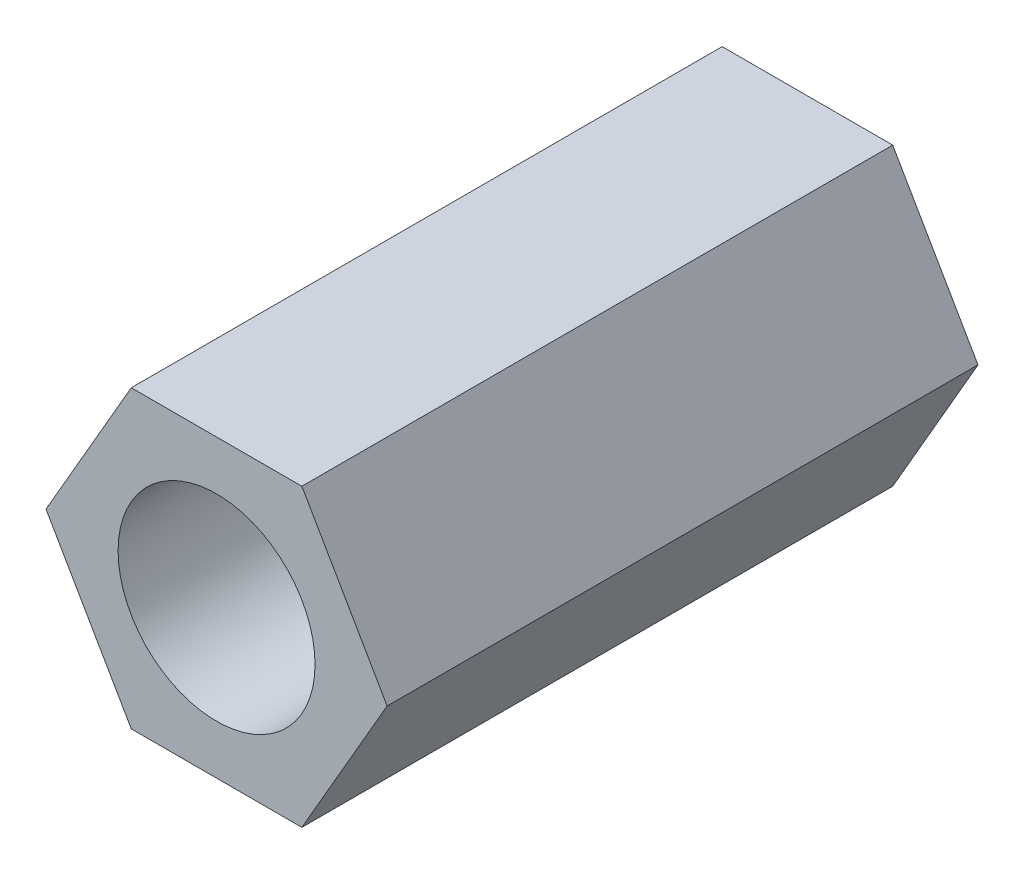
ISO-10303-21;
HEADER;
FILE_DESCRIPTION(('STEP AP214'),'2;1');
FILE_NAME('part.step','',(''),(''),'','','');
FILE_SCHEMA(('AUTOMOTIVE_DESIGN { 1 0 10303 214 1 1 1 1 }'));
ENDSEC;
DATA;
#1=APPLICATION_CONTEXT('core data for automotive mechanical design processes');
#2=APPLICATION_PROTOCOL_DEFINITION('international standard','automotive_design',2000,#1);
#3=PRODUCT_CONTEXT('',#1,'mechanical');
#4=PRODUCT('Part','Part','',(#3));
#5=PRODUCT_RELATED_PRODUCT_CATEGORY('part','',(#4));
#6=PRODUCT_DEFINITION_FORMATION('','',#4);
#7=PRODUCT_DEFINITION_CONTEXT('part definition',#1,'design');
#8=PRODUCT_DEFINITION('design','',#6,#7);
#9=PRODUCT_DEFINITION_SHAPE('','',#8);
#10=(LENGTH_UNIT() NAMED_UNIT(*) SI_UNIT(.MILLI.,.METRE.));
#11=(NAMED_UNIT(*) PLANE_ANGLE_UNIT() SI_UNIT($,.RADIAN.));
#12=(NAMED_UNIT(*) SI_UNIT($,.STERADIAN.) SOLID_ANGLE_UNIT());
#13=UNCERTAINTY_MEASURE_WITH_UNIT(LENGTH_MEASURE(1.E-05),#10,'distance_accuracy_value','');
#14=(GEOMETRIC_REPRESENTATION_CONTEXT(3) GLOBAL_UNCERTAINTY_ASSIGNED_CONTEXT((#13)) GLOBAL_UNIT_ASSIGNED_CONTEXT((#10,
#11,#12)) REPRESENTATION_CONTEXT('',''));
#15=CARTESIAN_POINT('',(0.,0.,0.));
#16=DIRECTION('',(0.,0.,1.));
#17=DIRECTION('',(1.,0.,0.));
#18=AXIS2_PLACEMENT_3D('',#15,#16,#17);
#19=CARTESIAN_POINT('',(-5.49926131403119,9.52500000000001,38.1));
#20=DIRECTION('',(0.866025403784439,-0.5,0.));
#21=DIRECTION('',(0.5,0.866025403784439,0.));
#22=AXIS2_PLACEMENT_3D('',#19,#20,#21);
#23=PLANE('',#22);
#24=DIRECTION('',(-0.5,-0.866025403784439,0.));
#25=VECTOR('',#24,1.);
#26=CARTESIAN_POINT('',(-5.49926131403119,9.52500000000001,0.));
#27=LINE('',#26,#25);
#28=CARTESIAN_POINT('',(-5.49926131403119,9.52500000000001,0.));
#29=VERTEX_POINT('',#28);
#30=CARTESIAN_POINT('',(-10.9985226280624,0.,0.));
#31=VERTEX_POINT('',#30);
#32=EDGE_CURVE('E116',#29,#31,#27,.T.);
#33=ORIENTED_EDGE('',*,*,#32,.T.);
#34=DIRECTION('',(0.,0.,-1.));
#35=VECTOR('',#34,1.);
#36=CARTESIAN_POINT('',(-10.9985226280624,0.,38.1));
#37=LINE('',#36,#35);
#38=CARTESIAN_POINT('',(-10.9985226280624,0.,38.1));
#39=VERTEX_POINT('',#38);
#40=EDGE_CURVE('E11',#39,#31,#37,.T.);
#41=ORIENTED_EDGE('',*,*,#40,.F.);
#42=DIRECTION('',(-0.5,-0.866025403784439,0.));
#43=VECTOR('',#42,1.);
#44=CARTESIAN_POINT('',(-5.49926131403119,9.52500000000001,38.1));
#45=LINE('',#44,#43);
#46=CARTESIAN_POINT('',(-5.49926131403119,9.52500000000001,38.1));
#47=VERTEX_POINT('',#46);
#48=EDGE_CURVE('E127',#47,#39,#45,.T.);
#49=ORIENTED_EDGE('',*,*,#48,.F.);
#50=DIRECTION('',(0.,0.,-1.));
#51=VECTOR('',#50,1.);
#52=CARTESIAN_POINT('',(-5.49926131403119,9.52500000000001,38.1));
#53=LINE('',#52,#51);
#54=EDGE_CURVE('E112',#47,#29,#53,.T.);
#55=ORIENTED_EDGE('',*,*,#54,.T.);
#56=EDGE_LOOP('',(#33,#41,#49,#55));
#57=FACE_BOUND('',#56,.T.);
#58=ADVANCED_FACE('F32',(#57),#23,.F.);
#59=CARTESIAN_POINT('',(-10.9985226280624,0.,38.1));
#60=DIRECTION('',(0.866025403784439,0.5,0.));
#61=DIRECTION('',(-0.5,0.866025403784439,0.));
#62=AXIS2_PLACEMENT_3D('',#59,#60,#61);
#63=PLANE('',#62);
#64=DIRECTION('',(0.5,-0.866025403784439,0.));
#65=VECTOR('',#64,1.);
#66=CARTESIAN_POINT('',(-10.9985226280624,0.,0.));
#67=LINE('',#66,#65);
#68=CARTESIAN_POINT('',(-5.4992613140312,-9.52499999999999,0.));
#69=VERTEX_POINT('',#68);
#70=EDGE_CURVE('E119',#31,#69,#67,.T.);
#71=ORIENTED_EDGE('',*,*,#70,.T.);
#72=DIRECTION('',(0.,0.,-1.));
#73=VECTOR('',#72,1.);
#74=CARTESIAN_POINT('',(-5.4992613140312,-9.52499999999999,38.1));
#75=LINE('',#74,#73);
#76=CARTESIAN_POINT('',(-5.4992613140312,-9.52499999999999,38.1));
#77=VERTEX_POINT('',#76);
#78=EDGE_CURVE('E40',#77,#69,#75,.T.);
#79=ORIENTED_EDGE('',*,*,#78,.F.);
#80=DIRECTION('',(0.5,-0.866025403784439,0.));
#81=VECTOR('',#80,1.);
#82=CARTESIAN_POINT('',(-10.9985226280624,0.,38.1));
#83=LINE('',#82,#81);
#84=EDGE_CURVE('E85',#39,#77,#83,.T.);
#85=ORIENTED_EDGE('',*,*,#84,.F.);
#86=ORIENTED_EDGE('',*,*,#40,.T.);
#87=EDGE_LOOP('',(#71,#79,#85,#86));
#88=FACE_BOUND('',#87,.T.);
#89=ADVANCED_FACE('F152',(#88),#63,.F.);
#90=CARTESIAN_POINT('',(-5.4992613140312,-9.52499999999999,38.1));
#91=DIRECTION('',(0.,1.,0.));
#92=DIRECTION('',(-1.,0.,0.));
#93=AXIS2_PLACEMENT_3D('',#90,#91,#92);
#94=PLANE('',#93);
#95=DIRECTION('',(1.,0.,0.));
#96=VECTOR('',#95,1.);
#97=CARTESIAN_POINT('',(-5.4992613140312,-9.52499999999999,0.));
#98=LINE('',#97,#96);
#99=CARTESIAN_POINT('',(5.49926131403118,-9.52499999999999,0.));
#100=VERTEX_POINT('',#99);
#101=EDGE_CURVE('E122',#69,#100,#98,.T.);
#102=ORIENTED_EDGE('',*,*,#101,.T.);
#103=DIRECTION('',(0.,0.,-1.));
#104=VECTOR('',#103,1.);
#105=CARTESIAN_POINT('',(5.49926131403118,-9.52499999999999,38.1));
#106=LINE('',#105,#104);
#107=CARTESIAN_POINT('',(5.49926131403118,-9.52499999999999,38.1));
#108=VERTEX_POINT('',#107);
#109=EDGE_CURVE('E107',#108,#100,#106,.T.);
#110=ORIENTED_EDGE('',*,*,#109,.F.);
#111=DIRECTION('',(1.,0.,0.));
#112=VECTOR('',#111,1.);
#113=CARTESIAN_POINT('',(-5.4992613140312,-9.52499999999999,38.1));
#114=LINE('',#113,#112);
#115=EDGE_CURVE('E98',#77,#108,#114,.T.);
#116=ORIENTED_EDGE('',*,*,#115,.F.);
#117=ORIENTED_EDGE('',*,*,#78,.T.);
#118=EDGE_LOOP('',(#102,#110,#116,#117));
#119=FACE_BOUND('',#118,.T.);
#120=ADVANCED_FACE('F133',(#119),#94,.F.);
#121=CARTESIAN_POINT('',(5.49926131403118,-9.52499999999999,38.1));
#122=DIRECTION('',(-0.866025403784439,0.5,0.));
#123=DIRECTION('',(-0.5,-0.866025403784439,0.));
#124=AXIS2_PLACEMENT_3D('',#121,#122,#123);
#125=PLANE('',#124);
#126=DIRECTION('',(0.5,0.866025403784439,0.));
#127=VECTOR('',#126,1.);
#128=CARTESIAN_POINT('',(5.49926131403118,-9.52499999999999,0.));
#129=LINE('',#128,#127);
#130=CARTESIAN_POINT('',(10.9985226280624,0.,0.));
#131=VERTEX_POINT('',#130);
#132=EDGE_CURVE('E106',#100,#131,#129,.T.);
#133=ORIENTED_EDGE('',*,*,#132,.T.);
#134=DIRECTION('',(0.,0.,-1.));
#135=VECTOR('',#134,1.);
#136=CARTESIAN_POINT('',(10.9985226280624,0.,38.1));
#137=LINE('',#136,#135);
#138=CARTESIAN_POINT('',(10.9985226280624,0.,38.1));
#139=VERTEX_POINT('',#138);
#140=EDGE_CURVE('E103',#139,#131,#137,.T.);
#141=ORIENTED_EDGE('',*,*,#140,.F.);
#142=DIRECTION('',(0.5,0.866025403784439,0.));
#143=VECTOR('',#142,1.);
#144=CARTESIAN_POINT('',(5.49926131403118,-9.52499999999999,38.1));
#145=LINE('',#144,#143);
#146=EDGE_CURVE('E92',#108,#139,#145,.T.);
#147=ORIENTED_EDGE('',*,*,#146,.F.);
#148=ORIENTED_EDGE('',*,*,#109,.T.);
#149=EDGE_LOOP('',(#133,#141,#147,#148));
#150=FACE_BOUND('',#149,.T.);
#151=ADVANCED_FACE('F104',(#150),#125,.F.);
#152=CARTESIAN_POINT('',(10.9985226280624,0.,38.1));
#153=DIRECTION('',(-0.866025403784439,-0.5,0.));
#154=DIRECTION('',(0.5,-0.866025403784439,0.));
#155=AXIS2_PLACEMENT_3D('',#152,#153,#154);
#156=PLANE('',#155);
#157=DIRECTION('',(-0.5,0.866025403784439,0.));
#158=VECTOR('',#157,1.);
#159=CARTESIAN_POINT('',(10.9985226280624,0.,0.));
#160=LINE('',#159,#158);
#161=CARTESIAN_POINT('',(5.49926131403119,9.52500000000001,0.));
#162=VERTEX_POINT('',#161);
#163=EDGE_CURVE('E71',#131,#162,#160,.T.);
#164=ORIENTED_EDGE('',*,*,#163,.T.);
#165=DIRECTION('',(0.,0.,-1.));
#166=VECTOR('',#165,1.);
#167=CARTESIAN_POINT('',(5.49926131403119,9.52500000000001,38.1));
#168=LINE('',#167,#166);
#169=CARTESIAN_POINT('',(5.49926131403119,9.52500000000001,38.1));
#170=VERTEX_POINT('',#169);
#171=EDGE_CURVE('E108',#170,#162,#168,.T.);
#172=ORIENTED_EDGE('',*,*,#171,.F.);
#173=DIRECTION('',(-0.5,0.866025403784439,0.));
#174=VECTOR('',#173,1.);
#175=CARTESIAN_POINT('',(10.9985226280624,0.,38.1));
#176=LINE('',#175,#174);
#177=EDGE_CURVE('E96',#139,#170,#176,.T.);
#178=ORIENTED_EDGE('',*,*,#177,.F.);
#179=ORIENTED_EDGE('',*,*,#140,.T.);
#180=EDGE_LOOP('',(#164,#172,#178,#179));
#181=FACE_BOUND('',#180,.T.);
#182=ADVANCED_FACE('F110',(#181),#156,.F.);
#183=CARTESIAN_POINT('',(5.49926131403119,9.52500000000001,38.1));
#184=DIRECTION('',(0.,-1.,0.));
#185=DIRECTION('',(0.,0.,-1.));
#186=AXIS2_PLACEMENT_3D('',#183,#184,#185);
#187=PLANE('',#186);
#188=DIRECTION('',(-1.,0.,0.));
#189=VECTOR('',#188,1.);
#190=CARTESIAN_POINT('',(5.49926131403119,9.52500000000001,0.));
#191=LINE('',#190,#189);
#192=EDGE_CURVE('E77',#162,#29,#191,.T.);
#193=ORIENTED_EDGE('',*,*,#192,.T.);
#194=ORIENTED_EDGE('',*,*,#54,.F.);
#195=DIRECTION('',(-1.,0.,0.));
#196=VECTOR('',#195,1.);
#197=CARTESIAN_POINT('',(5.49926131403119,9.52500000000001,38.1));
#198=LINE('',#197,#196);
#199=EDGE_CURVE('E48',#170,#47,#198,.T.);
#200=ORIENTED_EDGE('',*,*,#199,.F.);
#201=ORIENTED_EDGE('',*,*,#171,.T.);
#202=EDGE_LOOP('',(#193,#194,#200,#201));
#203=FACE_BOUND('',#202,.T.);
#204=ADVANCED_FACE('F140',(#203),#187,.F.);
#205=CARTESIAN_POINT('',(-10.9985226280624,0.,38.1));
#206=DIRECTION('',(0.,0.,1.));
#207=DIRECTION('',(1.,0.,0.));
#208=AXIS2_PLACEMENT_3D('',#205,#206,#207);
#209=PLANE('',#208);
#210=CARTESIAN_POINT('',(0.,0.,38.1));
#211=DIRECTION('',(0.,0.,1.));
#212=DIRECTION('',(1.,0.,0.));
#213=AXIS2_PLACEMENT_3D('',#210,#211,#212);
#214=CIRCLE('',#213,6.35);
#215=CARTESIAN_POINT('',(6.35,0.,38.1));
#216=VERTEX_POINT('',#215);
#217=EDGE_CURVE('E207',#216,#216,#214,.T.);
#218=ORIENTED_EDGE('',*,*,#217,.F.);
#219=EDGE_LOOP('',(#218));
#220=FACE_BOUND('',#219,.T.);
#221=ORIENTED_EDGE('',*,*,#48,.T.);
#222=ORIENTED_EDGE('',*,*,#84,.T.);
#223=ORIENTED_EDGE('',*,*,#115,.T.);
#224=ORIENTED_EDGE('',*,*,#146,.T.);
#225=ORIENTED_EDGE('',*,*,#177,.T.);
#226=ORIENTED_EDGE('',*,*,#199,.T.);
#227=EDGE_LOOP('',(#221,#222,#223,#224,#225,#226));
#228=FACE_BOUND('',#227,.T.);
#229=ADVANCED_FACE('F94',(#220,#228),#209,.T.);
#230=CARTESIAN_POINT('',(-10.9985226280624,0.,0.));
#231=DIRECTION('',(0.,0.,1.));
#232=DIRECTION('',(1.,0.,0.));
#233=AXIS2_PLACEMENT_3D('',#230,#231,#232);
#234=PLANE('',#233);
#235=CARTESIAN_POINT('',(0.,0.,0.));
#236=DIRECTION('',(0.,0.,1.));
#237=DIRECTION('',(1.,0.,0.));
#238=AXIS2_PLACEMENT_3D('',#235,#236,#237);
#239=CIRCLE('',#238,6.35);
#240=CARTESIAN_POINT('',(6.35,0.,0.));
#241=VERTEX_POINT('',#240);
#242=EDGE_CURVE('E120',#241,#241,#239,.T.);
#243=ORIENTED_EDGE('',*,*,#242,.T.);
#244=EDGE_LOOP('',(#243));
#245=FACE_BOUND('',#244,.T.);
#246=ORIENTED_EDGE('',*,*,#32,.F.);
#247=ORIENTED_EDGE('',*,*,#192,.F.);
#248=ORIENTED_EDGE('',*,*,#163,.F.);
#249=ORIENTED_EDGE('',*,*,#132,.F.);
#250=ORIENTED_EDGE('',*,*,#101,.F.);
#251=ORIENTED_EDGE('',*,*,#70,.F.);
#252=EDGE_LOOP('',(#246,#247,#248,#249,#250,#251));
#253=FACE_BOUND('',#252,.T.);
#254=ADVANCED_FACE('F136',(#245,#253),#234,.F.);
#255=CARTESIAN_POINT('',(0.,0.,0.));
#256=DIRECTION('',(0.,0.,1.));
#257=DIRECTION('',(1.,0.,0.));
#258=AXIS2_PLACEMENT_3D('',#255,#256,#257);
#259=CYLINDRICAL_SURFACE('',#258,6.35);
#260=CARTESIAN_POINT('',(6.35,0.,0.));
#261=CARTESIAN_POINT('',(6.35,0.,0.396875));
#262=CARTESIAN_POINT('',(6.35,0.,0.79375));
#263=CARTESIAN_POINT('',(6.35,0.,1.5875));
#264=CARTESIAN_POINT('',(6.35,0.,1.984375));
#265=CARTESIAN_POINT('',(6.35,0.,2.778125));
#266=CARTESIAN_POINT('',(6.35,0.,3.175));
#267=CARTESIAN_POINT('',(6.35,0.,3.96875));
#268=CARTESIAN_POINT('',(6.35,0.,4.365625));
#269=CARTESIAN_POINT('',(6.35,0.,5.159375));
#270=CARTESIAN_POINT('',(6.35,0.,5.55625));
#271=CARTESIAN_POINT('',(6.35,0.,6.35));
#272=CARTESIAN_POINT('',(6.35,0.,6.746875));
#273=CARTESIAN_POINT('',(6.35,0.,7.540625));
#274=CARTESIAN_POINT('',(6.35,0.,7.9375));
#275=CARTESIAN_POINT('',(6.35,0.,8.73125));
#276=CARTESIAN_POINT('',(6.35,0.,9.128125));
#277=CARTESIAN_POINT('',(6.35,0.,9.921875));
#278=CARTESIAN_POINT('',(6.35,0.,10.31875));
#279=CARTESIAN_POINT('',(6.35,0.,11.1125));
#280=CARTESIAN_POINT('',(6.35,0.,11.509375));
#281=CARTESIAN_POINT('',(6.35,0.,12.303125));
#282=CARTESIAN_POINT('',(6.35,0.,12.7));
#283=CARTESIAN_POINT('',(6.35,0.,13.49375));
#284=CARTESIAN_POINT('',(6.35,0.,13.890625));
#285=CARTESIAN_POINT('',(6.35,0.,14.684375));
#286=CARTESIAN_POINT('',(6.35,0.,15.08125));
#287=CARTESIAN_POINT('',(6.35,0.,15.875));
#288=CARTESIAN_POINT('',(6.35,0.,16.271875));
#289=CARTESIAN_POINT('',(6.35,0.,17.065625));
#290=CARTESIAN_POINT('',(6.35,0.,17.4625));
#291=CARTESIAN_POINT('',(6.35,0.,18.25625));
#292=CARTESIAN_POINT('',(6.35,0.,18.653125));
#293=CARTESIAN_POINT('',(6.35,0.,19.446875));
#294=CARTESIAN_POINT('',(6.35,0.,19.84375));
#295=CARTESIAN_POINT('',(6.35,0.,20.6375));
#296=CARTESIAN_POINT('',(6.35,0.,21.034375));
#297=CARTESIAN_POINT('',(6.35,0.,21.828125));
#298=CARTESIAN_POINT('',(6.35,0.,22.225));
#299=CARTESIAN_POINT('',(6.35,0.,23.01875));
#300=CARTESIAN_POINT('',(6.35,0.,23.415625));
#301=CARTESIAN_POINT('',(6.35,0.,24.209375));
#302=CARTESIAN_POINT('',(6.35,0.,24.60625));
#303=CARTESIAN_POINT('',(6.35,0.,25.4));
#304=CARTESIAN_POINT('',(6.35,0.,25.796875));
#305=CARTESIAN_POINT('',(6.35,0.,26.590625));
#306=CARTESIAN_POINT('',(6.35,0.,26.9875));
#307=CARTESIAN_POINT('',(6.35,0.,27.78125));
#308=CARTESIAN_POINT('',(6.35,0.,28.178125));
#309=CARTESIAN_POINT('',(6.35,0.,28.971875));
#310=CARTESIAN_POINT('',(6.35,0.,29.36875));
#311=CARTESIAN_POINT('',(6.35,0.,30.1625));
#312=CARTESIAN_POINT('',(6.35,0.,30.559375));
#313=CARTESIAN_POINT('',(6.35,0.,31.353125));
#314=CARTESIAN_POINT('',(6.35,0.,31.75));
#315=CARTESIAN_POINT('',(6.35,0.,32.54375));
#316=CARTESIAN_POINT('',(6.35,0.,32.940625));
#317=CARTESIAN_POINT('',(6.35,0.,33.734375));
#318=CARTESIAN_POINT('',(6.35,0.,34.13125));
#319=CARTESIAN_POINT('',(6.35,0.,34.925));
#320=CARTESIAN_POINT('',(6.35,0.,35.321875));
#321=CARTESIAN_POINT('',(6.35,0.,36.115625));
#322=CARTESIAN_POINT('',(6.35,0.,36.5125));
#323=CARTESIAN_POINT('',(6.35,0.,37.30625));
#324=CARTESIAN_POINT('',(6.35,0.,37.703125));
#325=CARTESIAN_POINT('',(6.35,0.,38.1));
#326=B_SPLINE_CURVE_WITH_KNOTS('',3,(#260,#261,#262,#263,#264,#265,#266,#267,#268,#269,#270,
#271,#272,#273,#274,#275,#276,#277,#278,#279,#280,#281,#282,#283,#284,#285,#286,#287,#288,#289,
#290,#291,#292,#293,#294,#295,#296,#297,#298,#299,#300,#301,#302,#303,#304,#305,#306,#307,#308,
#309,#310,#311,#312,#313,#314,#315,#316,#317,#318,#319,#320,#321,#322,#323,#324,#325),
.UNSPECIFIED.,.F.,.F.,(4,2,2,2,2,2,2,2,2,2,2,2,2,2,2,2,2,2,2,2,2,2,2,2,2,2,2,2,2,2,2,2,4),(0.,
1.190625,2.38125,3.571875,4.7625,5.953125,7.14375,8.334375,9.525,10.715625,11.90625,13.096875,
14.2875,15.478125,16.66875,17.859375,19.05,20.240625,21.43125,22.621875,23.8125,25.003125,
26.19375,27.384375,28.575,29.765625,30.95625,32.146875,33.3375,34.528125,35.71875,36.909375,
38.1),.UNSPECIFIED.);
#327=EDGE_CURVE('BSEAM189',#241,#216,#326,.T.);
#328=ORIENTED_EDGE('',*,*,#242,.F.);
#329=ORIENTED_EDGE('',*,*,#217,.T.);
#330=ORIENTED_EDGE('',*,*,#327,.T.);
#331=ORIENTED_EDGE('',*,*,#327,.F.);
#332=EDGE_LOOP('',(#328,#330,#329,#331));
#333=FACE_BOUND('',#332,.T.);
#334=ADVANCED_FACE('F189',(#333),#259,.F.);
#335=CLOSED_SHELL('',(#58,#89,#120,#151,#182,#204,#229,#254,#334));
#336=MANIFOLD_SOLID_BREP('B2',#335);
#337=ADVANCED_BREP_SHAPE_REPRESENTATION('',(#18,#336),#14);
#338=SHAPE_DEFINITION_REPRESENTATION(#9,#337);
ENDSEC;
END-ISO-10303-21;
